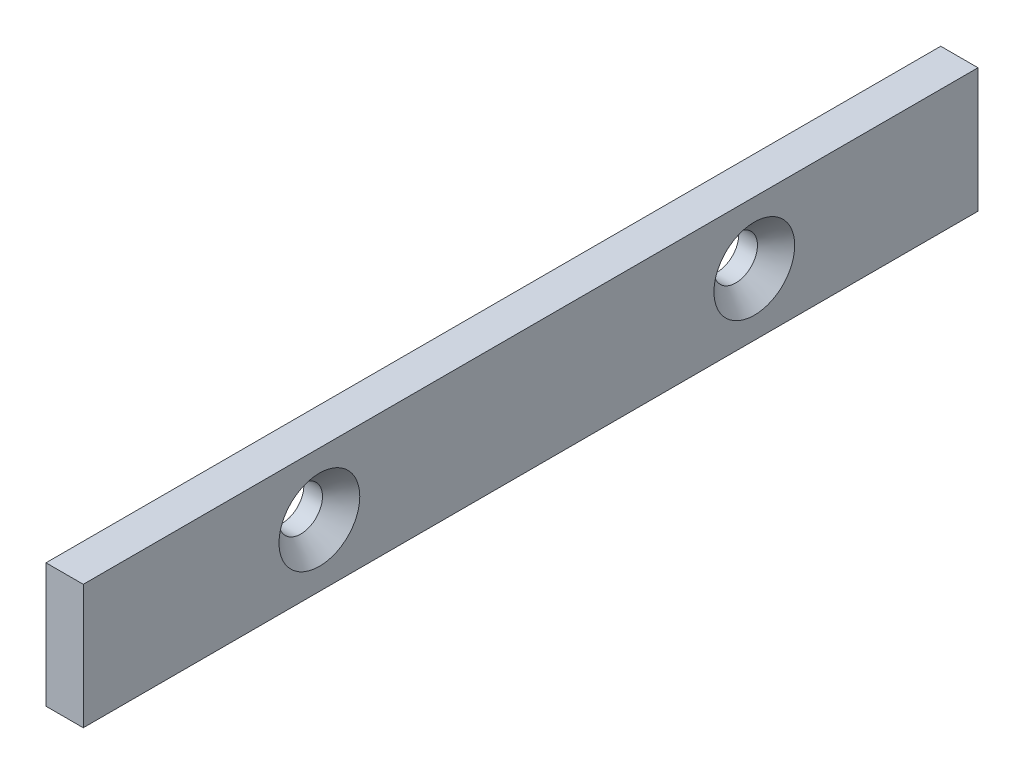
ISO-10303-21;
HEADER;
FILE_DESCRIPTION(('STEP AP214'),'2;1');
FILE_NAME('part.step','',(''),(''),'','','');
FILE_SCHEMA(('AUTOMOTIVE_DESIGN { 1 0 10303 214 1 1 1 1 }'));
ENDSEC;
DATA;
#1=APPLICATION_CONTEXT('core data for automotive mechanical design processes');
#2=APPLICATION_PROTOCOL_DEFINITION('international standard','automotive_design',2000,#1);
#3=PRODUCT_CONTEXT('',#1,'mechanical');
#4=PRODUCT('Part','Part','',(#3));
#5=PRODUCT_RELATED_PRODUCT_CATEGORY('part','',(#4));
#6=PRODUCT_DEFINITION_FORMATION('','',#4);
#7=PRODUCT_DEFINITION_CONTEXT('part definition',#1,'design');
#8=PRODUCT_DEFINITION('design','',#6,#7);
#9=PRODUCT_DEFINITION_SHAPE('','',#8);
#10=(LENGTH_UNIT() NAMED_UNIT(*) SI_UNIT(.MILLI.,.METRE.));
#11=(NAMED_UNIT(*) PLANE_ANGLE_UNIT() SI_UNIT($,.RADIAN.));
#12=(NAMED_UNIT(*) SI_UNIT($,.STERADIAN.) SOLID_ANGLE_UNIT());
#13=UNCERTAINTY_MEASURE_WITH_UNIT(LENGTH_MEASURE(1.E-05),#10,'distance_accuracy_value','');
#14=(GEOMETRIC_REPRESENTATION_CONTEXT(3) GLOBAL_UNCERTAINTY_ASSIGNED_CONTEXT((#13)) GLOBAL_UNIT_ASSIGNED_CONTEXT((#10,
#11,#12)) REPRESENTATION_CONTEXT('',''));
#15=CARTESIAN_POINT('',(0.,0.,0.));
#16=DIRECTION('',(0.,0.,1.));
#17=DIRECTION('',(1.,0.,0.));
#18=AXIS2_PLACEMENT_3D('',#15,#16,#17);
#19=CARTESIAN_POINT('',(-5.9999999999979,10.,-72.));
#20=DIRECTION('',(0.,0.,-1.));
#21=DIRECTION('',(-1.,0.,0.));
#22=AXIS2_PLACEMENT_3D('',#19,#20,#21);
#23=PLANE('',#22);
#24=DIRECTION('',(0.,1.,0.));
#25=VECTOR('',#24,1.);
#26=CARTESIAN_POINT('',(2.1094237467878E-12,10.,-72.));
#27=LINE('',#26,#25);
#28=CARTESIAN_POINT('',(0.,-10.,-72.));
#29=VERTEX_POINT('',#28);
#30=CARTESIAN_POINT('',(2.1094237467878E-12,10.,-72.));
#31=VERTEX_POINT('',#30);
#32=EDGE_CURVE('E121',#29,#31,#27,.T.);
#33=ORIENTED_EDGE('',*,*,#32,.F.);
#34=DIRECTION('',(1.,0.,0.));
#35=VECTOR('',#34,1.);
#36=CARTESIAN_POINT('',(-6.00000000000001,-10.,-72.));
#37=LINE('',#36,#35);
#38=CARTESIAN_POINT('',(-6.00000000000001,-10.,-72.));
#39=VERTEX_POINT('',#38);
#40=EDGE_CURVE('E61',#39,#29,#37,.T.);
#41=ORIENTED_EDGE('',*,*,#40,.F.);
#42=DIRECTION('',(0.,1.,0.));
#43=VECTOR('',#42,1.);
#44=CARTESIAN_POINT('',(-5.9999999999979,10.,-72.));
#45=LINE('',#44,#43);
#46=CARTESIAN_POINT('',(-5.9999999999979,10.,-72.));
#47=VERTEX_POINT('',#46);
#48=EDGE_CURVE('E115',#39,#47,#45,.T.);
#49=ORIENTED_EDGE('',*,*,#48,.T.);
#50=DIRECTION('',(1.,0.,0.));
#51=VECTOR('',#50,1.);
#52=CARTESIAN_POINT('',(-5.9999999999979,10.,-72.));
#53=LINE('',#52,#51);
#54=EDGE_CURVE('E95',#47,#31,#53,.T.);
#55=ORIENTED_EDGE('',*,*,#54,.T.);
#56=EDGE_LOOP('',(#33,#41,#49,#55));
#57=FACE_BOUND('',#56,.T.);
#58=ADVANCED_FACE('F44',(#57),#23,.T.);
#59=CARTESIAN_POINT('',(-6.00000000000223,-10.,72.0000000000001));
#60=DIRECTION('',(0.,-1.,0.));
#61=DIRECTION('',(0.,0.,-1.));
#62=AXIS2_PLACEMENT_3D('',#59,#60,#61);
#63=PLANE('',#62);
#64=DIRECTION('',(0.,0.,-1.));
#65=VECTOR('',#64,1.);
#66=CARTESIAN_POINT('',(-2.22044604925031E-12,-10.,72.));
#67=LINE('',#66,#65);
#68=CARTESIAN_POINT('',(-2.22044604925031E-12,-10.,72.));
#69=VERTEX_POINT('',#68);
#70=EDGE_CURVE('E117',#69,#29,#67,.T.);
#71=ORIENTED_EDGE('',*,*,#70,.F.);
#72=DIRECTION('',(1.,0.,0.));
#73=VECTOR('',#72,1.);
#74=CARTESIAN_POINT('',(-6.00000000000223,-10.,72.0000000000001));
#75=LINE('',#74,#73);
#76=CARTESIAN_POINT('',(-6.00000000000223,-10.,72.0000000000001));
#77=VERTEX_POINT('',#76);
#78=EDGE_CURVE('E84',#77,#69,#75,.T.);
#79=ORIENTED_EDGE('',*,*,#78,.F.);
#80=DIRECTION('',(0.,0.,-1.));
#81=VECTOR('',#80,1.);
#82=CARTESIAN_POINT('',(-6.00000000000223,-10.,72.0000000000001));
#83=LINE('',#82,#81);
#84=EDGE_CURVE('E110',#77,#39,#83,.T.);
#85=ORIENTED_EDGE('',*,*,#84,.T.);
#86=ORIENTED_EDGE('',*,*,#40,.T.);
#87=EDGE_LOOP('',(#71,#79,#85,#86));
#88=FACE_BOUND('',#87,.T.);
#89=ADVANCED_FACE('F186',(#88),#63,.T.);
#90=CARTESIAN_POINT('',(-6.00000000000012,10.,72.0000000000001));
#91=DIRECTION('',(0.,0.,1.));
#92=DIRECTION('',(1.,0.,0.));
#93=AXIS2_PLACEMENT_3D('',#90,#91,#92);
#94=PLANE('',#93);
#95=DIRECTION('',(0.,-1.,0.));
#96=VECTOR('',#95,1.);
#97=CARTESIAN_POINT('',(-1.11022302462516E-13,10.,72.));
#98=LINE('',#97,#96);
#99=CARTESIAN_POINT('',(-1.11022302462516E-13,10.,72.));
#100=VERTEX_POINT('',#99);
#101=EDGE_CURVE('E99',#100,#69,#98,.T.);
#102=ORIENTED_EDGE('',*,*,#101,.F.);
#103=DIRECTION('',(1.,0.,0.));
#104=VECTOR('',#103,1.);
#105=CARTESIAN_POINT('',(-6.00000000000012,10.,72.0000000000001));
#106=LINE('',#105,#104);
#107=CARTESIAN_POINT('',(-6.00000000000012,10.,72.0000000000001));
#108=VERTEX_POINT('',#107);
#109=EDGE_CURVE('E92',#108,#100,#106,.T.);
#110=ORIENTED_EDGE('',*,*,#109,.F.);
#111=DIRECTION('',(0.,-1.,0.));
#112=VECTOR('',#111,1.);
#113=CARTESIAN_POINT('',(-6.00000000000012,10.,72.0000000000001));
#114=LINE('',#113,#112);
#115=EDGE_CURVE('E98',#108,#77,#114,.T.);
#116=ORIENTED_EDGE('',*,*,#115,.T.);
#117=ORIENTED_EDGE('',*,*,#78,.T.);
#118=EDGE_LOOP('',(#102,#110,#116,#117));
#119=FACE_BOUND('',#118,.T.);
#120=ADVANCED_FACE('F100',(#119),#94,.T.);
#121=CARTESIAN_POINT('',(-6.00000000000012,10.,72.0000000000001));
#122=DIRECTION('',(0.,1.,0.));
#123=DIRECTION('',(0.,0.,1.));
#124=AXIS2_PLACEMENT_3D('',#121,#122,#123);
#125=PLANE('',#124);
#126=DIRECTION('',(0.,0.,1.));
#127=VECTOR('',#126,1.);
#128=CARTESIAN_POINT('',(-1.11022302462516E-13,10.,72.));
#129=LINE('',#128,#127);
#130=EDGE_CURVE('E127',#31,#100,#129,.T.);
#131=ORIENTED_EDGE('',*,*,#130,.F.);
#132=ORIENTED_EDGE('',*,*,#54,.F.);
#133=DIRECTION('',(0.,0.,1.));
#134=VECTOR('',#133,1.);
#135=CARTESIAN_POINT('',(-6.00000000000012,10.,72.0000000000001));
#136=LINE('',#135,#134);
#137=EDGE_CURVE('E106',#47,#108,#136,.T.);
#138=ORIENTED_EDGE('',*,*,#137,.T.);
#139=ORIENTED_EDGE('',*,*,#109,.T.);
#140=EDGE_LOOP('',(#131,#132,#138,#139));
#141=FACE_BOUND('',#140,.T.);
#142=ADVANCED_FACE('F109',(#141),#125,.T.);
#143=CARTESIAN_POINT('',(-6.00000000000001,0.,0.));
#144=DIRECTION('',(1.,0.,0.));
#145=DIRECTION('',(0.,0.,-1.));
#146=AXIS2_PLACEMENT_3D('',#143,#144,#145);
#147=PLANE('',#146);
#148=CARTESIAN_POINT('',(-6.00000000000001,0.,-36.));
#149=DIRECTION('',(1.,0.,0.));
#150=DIRECTION('',(0.,0.,-1.));
#151=AXIS2_PLACEMENT_3D('',#148,#149,#150);
#152=CIRCLE('',#151,3.5);
#153=CARTESIAN_POINT('',(-6.00000000000001,0.,-39.5));
#154=VERTEX_POINT('',#153);
#155=EDGE_CURVE('E169',#154,#154,#152,.T.);
#156=ORIENTED_EDGE('',*,*,#155,.T.);
#157=EDGE_LOOP('',(#156));
#158=FACE_BOUND('',#157,.T.);
#159=CARTESIAN_POINT('',(-6.00000000000012,0.,34.));
#160=DIRECTION('',(1.,0.,0.));
#161=DIRECTION('',(0.,0.,-1.));
#162=AXIS2_PLACEMENT_3D('',#159,#160,#161);
#163=CIRCLE('',#162,3.5);
#164=CARTESIAN_POINT('',(-6.00000000000012,0.,30.5));
#165=VERTEX_POINT('',#164);
#166=EDGE_CURVE('E130',#165,#165,#163,.T.);
#167=ORIENTED_EDGE('',*,*,#166,.T.);
#168=EDGE_LOOP('',(#167));
#169=FACE_BOUND('',#168,.T.);
#170=ORIENTED_EDGE('',*,*,#48,.F.);
#171=ORIENTED_EDGE('',*,*,#84,.F.);
#172=ORIENTED_EDGE('',*,*,#115,.F.);
#173=ORIENTED_EDGE('',*,*,#137,.F.);
#174=EDGE_LOOP('',(#170,#171,#172,#173));
#175=FACE_BOUND('',#174,.T.);
#176=ADVANCED_FACE('F104',(#158,#169,#175),#147,.F.);
#177=CARTESIAN_POINT('',(0.,0.,0.));
#178=DIRECTION('',(1.,0.,0.));
#179=DIRECTION('',(0.,0.,-1.));
#180=AXIS2_PLACEMENT_3D('',#177,#178,#179);
#181=PLANE('',#180);
#182=CARTESIAN_POINT('',(0.,0.,-36.));
#183=DIRECTION('',(1.,0.,0.));
#184=DIRECTION('',(0.,0.,-1.));
#185=AXIS2_PLACEMENT_3D('',#182,#183,#184);
#186=CIRCLE('',#185,6.49999999999999);
#187=CARTESIAN_POINT('',(0.,0.,-42.5));
#188=VERTEX_POINT('',#187);
#189=EDGE_CURVE('E57',#188,#188,#186,.F.);
#190=ORIENTED_EDGE('',*,*,#189,.T.);
#191=EDGE_LOOP('',(#190));
#192=FACE_BOUND('',#191,.T.);
#193=CARTESIAN_POINT('',(-1.11022302462516E-13,0.,34.));
#194=DIRECTION('',(1.,0.,0.));
#195=DIRECTION('',(0.,0.,-1.));
#196=AXIS2_PLACEMENT_3D('',#193,#194,#195);
#197=CIRCLE('',#196,6.49999999999998);
#198=CARTESIAN_POINT('',(-1.11022302462516E-13,0.,27.5));
#199=VERTEX_POINT('',#198);
#200=EDGE_CURVE('E144',#199,#199,#197,.F.);
#201=ORIENTED_EDGE('',*,*,#200,.T.);
#202=EDGE_LOOP('',(#201));
#203=FACE_BOUND('',#202,.T.);
#204=ORIENTED_EDGE('',*,*,#32,.T.);
#205=ORIENTED_EDGE('',*,*,#130,.T.);
#206=ORIENTED_EDGE('',*,*,#101,.T.);
#207=ORIENTED_EDGE('',*,*,#70,.T.);
#208=EDGE_LOOP('',(#204,#205,#206,#207));
#209=FACE_BOUND('',#208,.T.);
#210=ADVANCED_FACE('F153',(#192,#203,#209),#181,.T.);
#211=CARTESIAN_POINT('',(-6.00000000000012,0.,34.));
#212=DIRECTION('',(1.,0.,0.));
#213=DIRECTION('',(0.,0.,-1.));
#214=AXIS2_PLACEMENT_3D('',#211,#212,#213);
#215=CYLINDRICAL_SURFACE('',#214,3.5);
#216=CARTESIAN_POINT('',(-3.00000000000011,0.,34.0000000000018));
#217=DIRECTION('',(1.,0.,0.));
#218=DIRECTION('',(0.,0.,-1.));
#219=AXIS2_PLACEMENT_3D('',#216,#217,#218);
#220=CIRCLE('',#219,3.5);
#221=CARTESIAN_POINT('',(-3.00000000000011,0.,30.5000000000018));
#222=VERTEX_POINT('',#221);
#223=EDGE_CURVE('E11',#222,#222,#220,.T.);
#224=ORIENTED_EDGE('',*,*,#223,.T.);
#225=EDGE_LOOP('',(#224));
#226=FACE_BOUND('',#225,.T.);
#227=ORIENTED_EDGE('',*,*,#166,.F.);
#228=EDGE_LOOP('',(#227));
#229=FACE_BOUND('',#228,.T.);
#230=ADVANCED_FACE('F163',(#226,#229),#215,.F.);
#231=CARTESIAN_POINT('',(-6.00000000000001,0.,-36.));
#232=DIRECTION('',(1.,0.,0.));
#233=DIRECTION('',(0.,0.,-1.));
#234=AXIS2_PLACEMENT_3D('',#231,#232,#233);
#235=CYLINDRICAL_SURFACE('',#234,3.5);
#236=CARTESIAN_POINT('',(-3.,0.,-35.9999999999983));
#237=DIRECTION('',(1.,0.,0.));
#238=DIRECTION('',(0.,0.,-1.));
#239=AXIS2_PLACEMENT_3D('',#236,#237,#238);
#240=CIRCLE('',#239,3.5);
#241=CARTESIAN_POINT('',(-3.,0.,-39.4999999999983));
#242=VERTEX_POINT('',#241);
#243=EDGE_CURVE('E136',#242,#242,#240,.T.);
#244=ORIENTED_EDGE('',*,*,#243,.T.);
#245=EDGE_LOOP('',(#244));
#246=FACE_BOUND('',#245,.T.);
#247=ORIENTED_EDGE('',*,*,#155,.F.);
#248=EDGE_LOOP('',(#247));
#249=FACE_BOUND('',#248,.T.);
#250=ADVANCED_FACE('F157',(#246,#249),#235,.F.);
#251=CARTESIAN_POINT('',(-3.,0.,-35.9999999999983));
#252=DIRECTION('',(1.,0.,0.));
#253=DIRECTION('',(0.,0.,-1.));
#254=AXIS2_PLACEMENT_3D('',#251,#252,#253);
#255=CONICAL_SURFACE('',#254,3.5,0.785398163397444);
#256=ORIENTED_EDGE('',*,*,#189,.F.);
#257=EDGE_LOOP('',(#256));
#258=FACE_BOUND('',#257,.T.);
#259=ORIENTED_EDGE('',*,*,#243,.F.);
#260=EDGE_LOOP('',(#259));
#261=FACE_BOUND('',#260,.T.);
#262=ADVANCED_FACE('F156',(#258,#261),#255,.F.);
#263=CARTESIAN_POINT('',(-3.00000000000011,0.,34.0000000000018));
#264=DIRECTION('',(1.,0.,0.));
#265=DIRECTION('',(0.,0.,-1.));
#266=AXIS2_PLACEMENT_3D('',#263,#264,#265);
#267=CONICAL_SURFACE('',#266,3.5,0.785398163397444);
#268=ORIENTED_EDGE('',*,*,#200,.F.);
#269=EDGE_LOOP('',(#268));
#270=FACE_BOUND('',#269,.T.);
#271=ORIENTED_EDGE('',*,*,#223,.F.);
#272=EDGE_LOOP('',(#271));
#273=FACE_BOUND('',#272,.T.);
#274=ADVANCED_FACE('F48',(#270,#273),#267,.F.);
#275=CLOSED_SHELL('',(#58,#89,#120,#142,#176,#210,#230,#250,#262,#274));
#276=MANIFOLD_SOLID_BREP('B2',#275);
#277=ADVANCED_BREP_SHAPE_REPRESENTATION('',(#18,#276),#14);
#278=SHAPE_DEFINITION_REPRESENTATION(#9,#277);
ENDSEC;
END-ISO-10303-21;
